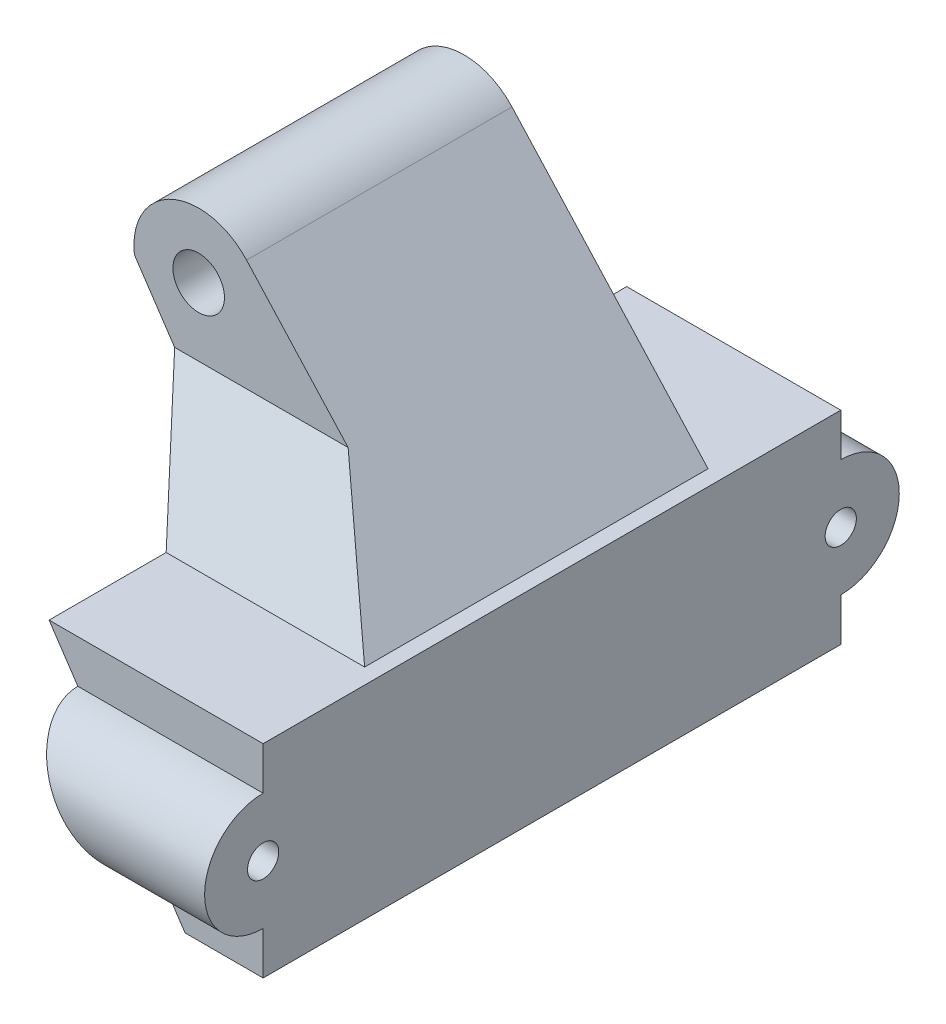
ISO-10303-21;
HEADER;
FILE_DESCRIPTION(('STEP AP214'),'2;1');
FILE_NAME('part.step','',(''),(''),'','','');
FILE_SCHEMA(('AUTOMOTIVE_DESIGN { 1 0 10303 214 1 1 1 1 }'));
ENDSEC;
DATA;
#1=APPLICATION_CONTEXT('core data for automotive mechanical design processes');
#2=APPLICATION_PROTOCOL_DEFINITION('international standard','automotive_design',2000,#1);
#3=PRODUCT_CONTEXT('',#1,'mechanical');
#4=PRODUCT('Part','Part','',(#3));
#5=PRODUCT_RELATED_PRODUCT_CATEGORY('part','',(#4));
#6=PRODUCT_DEFINITION_FORMATION('','',#4);
#7=PRODUCT_DEFINITION_CONTEXT('part definition',#1,'design');
#8=PRODUCT_DEFINITION('design','',#6,#7);
#9=PRODUCT_DEFINITION_SHAPE('','',#8);
#10=(LENGTH_UNIT() NAMED_UNIT(*) SI_UNIT(.MILLI.,.METRE.));
#11=(NAMED_UNIT(*) PLANE_ANGLE_UNIT() SI_UNIT($,.RADIAN.));
#12=(NAMED_UNIT(*) SI_UNIT($,.STERADIAN.) SOLID_ANGLE_UNIT());
#13=UNCERTAINTY_MEASURE_WITH_UNIT(LENGTH_MEASURE(1.E-05),#10,'distance_accuracy_value','');
#14=(GEOMETRIC_REPRESENTATION_CONTEXT(3) GLOBAL_UNCERTAINTY_ASSIGNED_CONTEXT((#13)) GLOBAL_UNIT_ASSIGNED_CONTEXT((#10,
#11,#12)) REPRESENTATION_CONTEXT('',''));
#15=CARTESIAN_POINT('',(0.,0.,0.));
#16=DIRECTION('',(0.,0.,1.));
#17=DIRECTION('',(1.,0.,0.));
#18=AXIS2_PLACEMENT_3D('',#15,#16,#17);
#19=CARTESIAN_POINT('',(0.,0.,-11.));
#20=DIRECTION('',(0.,0.,1.));
#21=DIRECTION('',(1.,0.,0.));
#22=AXIS2_PLACEMENT_3D('',#19,#20,#21);
#23=PLANE('',#22);
#24=CARTESIAN_POINT('',(0.,0.,-11.));
#25=DIRECTION('',(0.,0.,1.));
#26=DIRECTION('',(1.,0.,0.));
#27=AXIS2_PLACEMENT_3D('',#24,#25,#26);
#28=CIRCLE('',#27,1.65);
#29=CARTESIAN_POINT('',(1.65,0.,-11.));
#30=VERTEX_POINT('',#29);
#31=EDGE_CURVE('E140',#30,#30,#28,.T.);
#32=ORIENTED_EDGE('',*,*,#31,.T.);
#33=EDGE_LOOP('',(#32));
#34=FACE_BOUND('',#33,.T.);
#35=DIRECTION('',(1.,0.,0.));
#36=VECTOR('',#35,1.);
#37=CARTESIAN_POINT('',(0.,-11.,-11.));
#38=LINE('',#37,#36);
#39=CARTESIAN_POINT('',(2.91728849742033,-11.,-11.));
#40=VERTEX_POINT('',#39);
#41=CARTESIAN_POINT('',(15.6287254057007,-11.,-11.));
#42=VERTEX_POINT('',#41);
#43=EDGE_CURVE('E141',#40,#42,#38,.T.);
#44=ORIENTED_EDGE('',*,*,#43,.F.);
#45=DIRECTION('',(0.556679256856241,-0.830727515486265,0.));
#46=VECTOR('',#45,1.);
#47=CARTESIAN_POINT('',(-4.11996747168549,-0.498365360206194,-11.));
#48=LINE('',#47,#46);
#49=CARTESIAN_POINT('',(-4.11996747168549,-0.498365360206194,-11.));
#50=VERTEX_POINT('',#49);
#51=EDGE_CURVE('E222',#50,#40,#48,.T.);
#52=ORIENTED_EDGE('',*,*,#51,.F.);
#53=CARTESIAN_POINT('',(0.,0.,-11.));
#54=DIRECTION('',(0.,0.,1.));
#55=DIRECTION('',(1.,0.,0.));
#56=AXIS2_PLACEMENT_3D('',#53,#54,#55);
#57=CIRCLE('',#56,4.15);
#58=CARTESIAN_POINT('',(3.06851760696198,2.79404718925152,-11.));
#59=VERTEX_POINT('',#58);
#60=EDGE_CURVE('E220',#59,#50,#57,.T.);
#61=ORIENTED_EDGE('',*,*,#60,.F.);
#62=DIRECTION('',(-0.673264382952174,0.739401833002887,0.));
#63=VECTOR('',#62,1.);
#64=CARTESIAN_POINT('',(15.6287254057007,-11.,-11.));
#65=LINE('',#64,#63);
#66=EDGE_CURVE('E217',#42,#59,#65,.T.);
#67=ORIENTED_EDGE('',*,*,#66,.F.);
#68=EDGE_LOOP('',(#44,#52,#61,#67));
#69=FACE_BOUND('',#68,.T.);
#70=ADVANCED_FACE('F35',(#34,#69),#23,.F.);
#71=CARTESIAN_POINT('',(16.6287254057007,-11.,11.));
#72=DIRECTION('',(0.,-1.,0.));
#73=DIRECTION('',(1.,0.,0.));
#74=AXIS2_PLACEMENT_3D('',#71,#72,#73);
#75=PLANE('',#74);
#76=DIRECTION('',(0.,0.,-1.));
#77=VECTOR('',#76,1.);
#78=CARTESIAN_POINT('',(16.6287254057007,-11.,11.));
#79=LINE('',#78,#77);
#80=CARTESIAN_POINT('',(16.6287254057007,-11.,18.5));
#81=VERTEX_POINT('',#80);
#82=CARTESIAN_POINT('',(16.6287254057007,-11.,-18.5));
#83=VERTEX_POINT('',#82);
#84=EDGE_CURVE('E224',#81,#83,#79,.T.);
#85=ORIENTED_EDGE('',*,*,#84,.T.);
#86=DIRECTION('',(1.,0.,0.));
#87=VECTOR('',#86,1.);
#88=CARTESIAN_POINT('',(-43.8102507554737,-11.,-18.5));
#89=LINE('',#88,#87);
#90=CARTESIAN_POINT('',(2.91728849742033,-11.,-18.5));
#91=VERTEX_POINT('',#90);
#92=EDGE_CURVE('E206',#91,#83,#89,.T.);
#93=ORIENTED_EDGE('',*,*,#92,.F.);
#94=DIRECTION('',(0.,0.,1.));
#95=VECTOR('',#94,1.);
#96=CARTESIAN_POINT('',(2.91728849742033,-11.,0.));
#97=LINE('',#96,#95);
#98=EDGE_CURVE('E148',#91,#40,#97,.T.);
#99=ORIENTED_EDGE('',*,*,#98,.T.);
#100=ORIENTED_EDGE('',*,*,#43,.T.);
#101=DIRECTION('',(0.,0.,-1.));
#102=VECTOR('',#101,1.);
#103=CARTESIAN_POINT('',(15.6287254057007,-11.,11.));
#104=LINE('',#103,#102);
#105=CARTESIAN_POINT('',(15.6287254057007,-11.,11.));
#106=VERTEX_POINT('',#105);
#107=EDGE_CURVE('E43',#106,#42,#104,.T.);
#108=ORIENTED_EDGE('',*,*,#107,.F.);
#109=DIRECTION('',(1.,0.,0.));
#110=VECTOR('',#109,1.);
#111=CARTESIAN_POINT('',(0.,-11.,11.));
#112=LINE('',#111,#110);
#113=CARTESIAN_POINT('',(2.91728849742033,-11.,11.));
#114=VERTEX_POINT('',#113);
#115=EDGE_CURVE('E131',#114,#106,#112,.T.);
#116=ORIENTED_EDGE('',*,*,#115,.F.);
#117=CARTESIAN_POINT('',(2.91728849742033,-11.,18.5));
#118=VERTEX_POINT('',#117);
#119=EDGE_CURVE('E137',#114,#118,#97,.T.);
#120=ORIENTED_EDGE('',*,*,#119,.T.);
#121=DIRECTION('',(1.,0.,0.));
#122=VECTOR('',#121,1.);
#123=CARTESIAN_POINT('',(-43.8102507554737,-11.,18.5));
#124=LINE('',#123,#122);
#125=EDGE_CURVE('E204',#118,#81,#124,.T.);
#126=ORIENTED_EDGE('',*,*,#125,.T.);
#127=EDGE_LOOP('',(#85,#93,#99,#100,#108,#116,#120,#126));
#128=FACE_BOUND('',#127,.T.);
#129=ADVANCED_FACE('F37',(#128),#75,.F.);
#130=CARTESIAN_POINT('',(15.6287254057007,-11.,11.));
#131=DIRECTION('',(-0.739401833002887,-0.673264382952174,0.));
#132=DIRECTION('',(0.673264382952174,-0.739401833002887,0.));
#133=AXIS2_PLACEMENT_3D('',#130,#131,#132);
#134=PLANE('',#133);
#135=DIRECTION('',(0.,0.,-1.));
#136=VECTOR('',#135,1.);
#137=CARTESIAN_POINT('',(3.06851760696198,2.79404718925152,11.));
#138=LINE('',#137,#136);
#139=CARTESIAN_POINT('',(3.06851760696198,2.79404718925152,6.));
#140=VERTEX_POINT('',#139);
#141=EDGE_CURVE('E231',#140,#59,#138,.T.);
#142=ORIENTED_EDGE('',*,*,#141,.F.);
#143=DIRECTION('',(0.673264382952174,-0.739401833002887,0.));
#144=VECTOR('',#143,1.);
#145=CARTESIAN_POINT('',(15.6287254057007,-11.,6.));
#146=LINE('',#145,#144);
#147=CARTESIAN_POINT('',(9.57354952325945,-4.35,6.));
#148=VERTEX_POINT('',#147);
#149=EDGE_CURVE('E246',#140,#148,#146,.T.);
#150=ORIENTED_EDGE('',*,*,#149,.T.);
#151=DIRECTION('',(0.588442588566367,-0.646247654888709,0.485900492397526));
#152=VECTOR('',#151,1.);
#153=CARTESIAN_POINT('',(15.6287254057007,-11.,11.));
#154=LINE('',#153,#152);
#155=EDGE_CURVE('E173',#148,#106,#154,.T.);
#156=ORIENTED_EDGE('',*,*,#155,.T.);
#157=ORIENTED_EDGE('',*,*,#107,.T.);
#158=ORIENTED_EDGE('',*,*,#66,.T.);
#159=EDGE_LOOP('',(#142,#150,#156,#157,#158));
#160=FACE_BOUND('',#159,.T.);
#161=ADVANCED_FACE('F300',(#160),#134,.F.);
#162=CARTESIAN_POINT('',(0.,0.,11.));
#163=DIRECTION('',(0.,0.,-1.));
#164=DIRECTION('',(-1.,0.,0.));
#165=AXIS2_PLACEMENT_3D('',#162,#163,#164);
#166=CYLINDRICAL_SURFACE('',#165,4.15);
#167=DIRECTION('',(0.,0.,-1.));
#168=VECTOR('',#167,1.);
#169=CARTESIAN_POINT('',(-4.11996747168549,-0.498365360206194,11.));
#170=LINE('',#169,#168);
#171=CARTESIAN_POINT('',(-4.11996747168549,-0.498365360206194,6.));
#172=VERTEX_POINT('',#171);
#173=EDGE_CURVE('E58',#172,#50,#170,.T.);
#174=ORIENTED_EDGE('',*,*,#173,.F.);
#175=CARTESIAN_POINT('',(0.,0.,6.));
#176=DIRECTION('',(0.,0.,-1.));
#177=DIRECTION('',(0.,1.,0.));
#178=AXIS2_PLACEMENT_3D('',#175,#176,#177);
#179=CIRCLE('',#178,4.15);
#180=EDGE_CURVE('E238',#172,#140,#179,.T.);
#181=ORIENTED_EDGE('',*,*,#180,.T.);
#182=ORIENTED_EDGE('',*,*,#141,.T.);
#183=ORIENTED_EDGE('',*,*,#60,.T.);
#184=EDGE_LOOP('',(#174,#181,#182,#183));
#185=FACE_BOUND('',#184,.T.);
#186=ADVANCED_FACE('F312',(#185),#166,.T.);
#187=CARTESIAN_POINT('',(-4.11996747168549,-0.498365360206194,11.));
#188=DIRECTION('',(0.830727515486266,0.556679256856241,0.));
#189=DIRECTION('',(-0.556679256856241,0.830727515486266,0.));
#190=AXIS2_PLACEMENT_3D('',#187,#188,#189);
#191=PLANE('',#190);
#192=DIRECTION('',(-0.472146408909698,0.704579896571582,-0.529759320730514));
#193=VECTOR('',#192,1.);
#194=CARTESIAN_POINT('',(-2.14499720724337,-3.44559596154859,5.31999696357037));
#195=LINE('',#194,#193);
#196=CARTESIAN_POINT('',(-1.5389465364308,-4.35,6.));
#197=VERTEX_POINT('',#196);
#198=EDGE_CURVE('E11',#114,#197,#195,.T.);
#199=ORIENTED_EDGE('',*,*,#198,.T.);
#200=DIRECTION('',(-0.556679256856241,0.830727515486266,0.));
#201=VECTOR('',#200,1.);
#202=CARTESIAN_POINT('',(-4.11996747168549,-0.498365360206194,6.));
#203=LINE('',#202,#201);
#204=EDGE_CURVE('E235',#197,#172,#203,.T.);
#205=ORIENTED_EDGE('',*,*,#204,.T.);
#206=ORIENTED_EDGE('',*,*,#173,.T.);
#207=ORIENTED_EDGE('',*,*,#51,.T.);
#208=ORIENTED_EDGE('',*,*,#98,.F.);
#209=DIRECTION('',(-0.556679256856241,0.830727515486266,0.));
#210=VECTOR('',#209,1.);
#211=CARTESIAN_POINT('',(-16.6501290539271,18.2002835864801,-18.4999999999998));
#212=LINE('',#211,#210);
#213=CARTESIAN_POINT('',(4.76009245878734,-13.75,-18.5));
#214=VERTEX_POINT('',#213);
#215=EDGE_CURVE('E149',#214,#91,#212,.T.);
#216=ORIENTED_EDGE('',*,*,#215,.F.);
#217=CARTESIAN_POINT('',(7.27300695156052,-17.5,-18.5));
#218=DIRECTION('',(0.830727515486266,0.556679256856241,0.));
#219=DIRECTION('',(0.556679256856241,-0.830727515486266,0.));
#220=AXIS2_PLACEMENT_3D('',#217,#218,#219);
#221=ELLIPSE('',#220,4.51411555545375,3.75);
#222=CARTESIAN_POINT('',(9.78592144433372,-21.25,-18.5));
#223=VERTEX_POINT('',#222);
#224=EDGE_CURVE('E164',#214,#223,#221,.F.);
#225=ORIENTED_EDGE('',*,*,#224,.T.);
#226=DIRECTION('',(-0.556679256856241,0.830727515486266,0.));
#227=VECTOR('',#226,1.);
#228=CARTESIAN_POINT('',(-16.6501290539271,18.2002835864801,-18.4999999999998));
#229=LINE('',#228,#227);
#230=CARTESIAN_POINT('',(11.6287254057007,-24.,-18.5));
#231=VERTEX_POINT('',#230);
#232=EDGE_CURVE('E161',#231,#223,#229,.T.);
#233=ORIENTED_EDGE('',*,*,#232,.F.);
#234=DIRECTION('',(0.,0.,-1.));
#235=VECTOR('',#234,1.);
#236=CARTESIAN_POINT('',(11.6287254057007,-24.,11.));
#237=LINE('',#236,#235);
#238=CARTESIAN_POINT('',(11.6287254057007,-24.,18.5));
#239=VERTEX_POINT('',#238);
#240=EDGE_CURVE('E228',#239,#231,#237,.T.);
#241=ORIENTED_EDGE('',*,*,#240,.F.);
#242=DIRECTION('',(-0.556679256856241,0.830727515486266,0.));
#243=VECTOR('',#242,1.);
#244=CARTESIAN_POINT('',(-16.6501290539271,18.20028358648,18.5));
#245=LINE('',#244,#243);
#246=CARTESIAN_POINT('',(9.78592144433372,-21.25,18.5));
#247=VERTEX_POINT('',#246);
#248=EDGE_CURVE('E159',#239,#247,#245,.T.);
#249=ORIENTED_EDGE('',*,*,#248,.T.);
#250=CARTESIAN_POINT('',(7.27300695156052,-17.5,18.5));
#251=DIRECTION('',(0.830727515486266,0.556679256856241,0.));
#252=DIRECTION('',(0.556679256856241,-0.830727515486266,0.));
#253=AXIS2_PLACEMENT_3D('',#250,#251,#252);
#254=ELLIPSE('',#253,4.51411555545375,3.75);
#255=CARTESIAN_POINT('',(4.76009245878734,-13.75,18.5));
#256=VERTEX_POINT('',#255);
#257=EDGE_CURVE('E157',#247,#256,#254,.F.);
#258=ORIENTED_EDGE('',*,*,#257,.T.);
#259=DIRECTION('',(-0.556679256856241,0.830727515486266,0.));
#260=VECTOR('',#259,1.);
#261=CARTESIAN_POINT('',(-16.6501290539271,18.20028358648,18.5));
#262=LINE('',#261,#260);
#263=EDGE_CURVE('E146',#256,#118,#262,.T.);
#264=ORIENTED_EDGE('',*,*,#263,.T.);
#265=ORIENTED_EDGE('',*,*,#119,.F.);
#266=EDGE_LOOP('',(#199,#205,#206,#207,#208,#216,#225,#233,#241,#249,#258,#264,#265));
#267=FACE_BOUND('',#266,.T.);
#268=CARTESIAN_POINT('',(7.27300695156052,-17.5,-18.5));
#269=DIRECTION('',(0.830727515486266,0.556679256856241,0.));
#270=DIRECTION('',(0.556679256856241,-0.830727515486266,0.));
#271=AXIS2_PLACEMENT_3D('',#268,#269,#270);
#272=ELLIPSE('',#271,1.203764148121,1.);
#273=CARTESIAN_POINT('',(7.94311748296671,-18.5,-18.5));
#274=VERTEX_POINT('',#273);
#275=EDGE_CURVE('E165',#274,#274,#272,.F.);
#276=ORIENTED_EDGE('',*,*,#275,.F.);
#277=EDGE_LOOP('',(#276));
#278=FACE_BOUND('',#277,.T.);
#279=CARTESIAN_POINT('',(7.27300695156052,-17.5,18.5));
#280=DIRECTION('',(0.830727515486266,0.556679256856241,0.));
#281=DIRECTION('',(0.556679256856241,-0.830727515486266,0.));
#282=AXIS2_PLACEMENT_3D('',#279,#280,#281);
#283=ELLIPSE('',#282,1.203764148121,1.);
#284=CARTESIAN_POINT('',(7.94311748296671,-18.5,18.5));
#285=VERTEX_POINT('',#284);
#286=EDGE_CURVE('E168',#285,#285,#283,.F.);
#287=ORIENTED_EDGE('',*,*,#286,.F.);
#288=EDGE_LOOP('',(#287));
#289=FACE_BOUND('',#288,.T.);
#290=ADVANCED_FACE('F143',(#267,#278,#289),#191,.F.);
#291=CARTESIAN_POINT('',(11.6287254057007,-24.,11.));
#292=DIRECTION('',(0.,1.,0.));
#293=DIRECTION('',(0.,0.,1.));
#294=AXIS2_PLACEMENT_3D('',#291,#292,#293);
#295=PLANE('',#294);
#296=ORIENTED_EDGE('',*,*,#240,.T.);
#297=DIRECTION('',(1.,0.,0.));
#298=VECTOR('',#297,1.);
#299=CARTESIAN_POINT('',(-43.8102507554737,-24.,-18.5));
#300=LINE('',#299,#298);
#301=CARTESIAN_POINT('',(16.6287254057007,-24.,-18.5));
#302=VERTEX_POINT('',#301);
#303=EDGE_CURVE('E152',#231,#302,#300,.T.);
#304=ORIENTED_EDGE('',*,*,#303,.T.);
#305=DIRECTION('',(0.,0.,-1.));
#306=VECTOR('',#305,1.);
#307=CARTESIAN_POINT('',(16.6287254057007,-24.,11.));
#308=LINE('',#307,#306);
#309=CARTESIAN_POINT('',(16.6287254057007,-24.,18.5));
#310=VERTEX_POINT('',#309);
#311=EDGE_CURVE('E226',#310,#302,#308,.T.);
#312=ORIENTED_EDGE('',*,*,#311,.F.);
#313=DIRECTION('',(1.,0.,0.));
#314=VECTOR('',#313,1.);
#315=CARTESIAN_POINT('',(-43.8102507554737,-24.,18.5));
#316=LINE('',#315,#314);
#317=EDGE_CURVE('E197',#239,#310,#316,.T.);
#318=ORIENTED_EDGE('',*,*,#317,.F.);
#319=EDGE_LOOP('',(#296,#304,#312,#318));
#320=FACE_BOUND('',#319,.T.);
#321=ADVANCED_FACE('F266',(#320),#295,.F.);
#322=CARTESIAN_POINT('',(16.6287254057007,-24.,11.));
#323=DIRECTION('',(-1.,0.,0.));
#324=DIRECTION('',(0.,0.,1.));
#325=AXIS2_PLACEMENT_3D('',#322,#323,#324);
#326=PLANE('',#325);
#327=ORIENTED_EDGE('',*,*,#311,.T.);
#328=DIRECTION('',(0.,-1.,0.));
#329=VECTOR('',#328,1.);
#330=CARTESIAN_POINT('',(16.6287254057007,1.33306827115448E-13,-18.4999999999999));
#331=LINE('',#330,#329);
#332=CARTESIAN_POINT('',(16.6287254057007,-21.25,-18.5));
#333=VERTEX_POINT('',#332);
#334=EDGE_CURVE('E169',#333,#302,#331,.T.);
#335=ORIENTED_EDGE('',*,*,#334,.F.);
#336=CARTESIAN_POINT('',(16.6287254057007,-17.5,-18.5));
#337=DIRECTION('',(1.,0.,0.));
#338=DIRECTION('',(0.,0.,-1.));
#339=AXIS2_PLACEMENT_3D('',#336,#337,#338);
#340=CIRCLE('',#339,3.75);
#341=CARTESIAN_POINT('',(16.6287254057007,-13.75,-18.5));
#342=VERTEX_POINT('',#341);
#343=EDGE_CURVE('E172',#333,#342,#340,.T.);
#344=ORIENTED_EDGE('',*,*,#343,.T.);
#345=DIRECTION('',(0.,-1.,0.));
#346=VECTOR('',#345,1.);
#347=CARTESIAN_POINT('',(16.6287254057007,1.33306827115448E-13,-18.4999999999999));
#348=LINE('',#347,#346);
#349=EDGE_CURVE('E176',#83,#342,#348,.T.);
#350=ORIENTED_EDGE('',*,*,#349,.F.);
#351=ORIENTED_EDGE('',*,*,#84,.F.);
#352=DIRECTION('',(0.,-1.,0.));
#353=VECTOR('',#352,1.);
#354=CARTESIAN_POINT('',(16.6287254057007,0.,18.5));
#355=LINE('',#354,#353);
#356=CARTESIAN_POINT('',(16.6287254057007,-13.75,18.5));
#357=VERTEX_POINT('',#356);
#358=EDGE_CURVE('E179',#81,#357,#355,.T.);
#359=ORIENTED_EDGE('',*,*,#358,.T.);
#360=CARTESIAN_POINT('',(16.6287254057007,-17.5,18.5));
#361=DIRECTION('',(1.,0.,0.));
#362=DIRECTION('',(0.,0.,-1.));
#363=AXIS2_PLACEMENT_3D('',#360,#361,#362);
#364=CIRCLE('',#363,3.75);
#365=CARTESIAN_POINT('',(16.6287254057007,-21.25,18.5));
#366=VERTEX_POINT('',#365);
#367=EDGE_CURVE('E182',#357,#366,#364,.T.);
#368=ORIENTED_EDGE('',*,*,#367,.T.);
#369=DIRECTION('',(0.,-1.,0.));
#370=VECTOR('',#369,1.);
#371=CARTESIAN_POINT('',(16.6287254057007,0.,18.5));
#372=LINE('',#371,#370);
#373=EDGE_CURVE('E185',#366,#310,#372,.T.);
#374=ORIENTED_EDGE('',*,*,#373,.T.);
#375=EDGE_LOOP('',(#327,#335,#344,#350,#351,#359,#368,#374));
#376=FACE_BOUND('',#375,.T.);
#377=CARTESIAN_POINT('',(16.6287254057007,-17.5,-18.5));
#378=DIRECTION('',(1.,0.,0.));
#379=DIRECTION('',(0.,0.,-1.));
#380=AXIS2_PLACEMENT_3D('',#377,#378,#379);
#381=CIRCLE('',#380,1.);
#382=CARTESIAN_POINT('',(16.6287254057007,-17.5,-19.5));
#383=VERTEX_POINT('',#382);
#384=EDGE_CURVE('E188',#383,#383,#381,.T.);
#385=ORIENTED_EDGE('',*,*,#384,.F.);
#386=EDGE_LOOP('',(#385));
#387=FACE_BOUND('',#386,.T.);
#388=CARTESIAN_POINT('',(16.6287254057007,-17.5,18.5));
#389=DIRECTION('',(1.,0.,0.));
#390=DIRECTION('',(0.,0.,-1.));
#391=AXIS2_PLACEMENT_3D('',#388,#389,#390);
#392=CIRCLE('',#391,1.);
#393=CARTESIAN_POINT('',(16.6287254057007,-17.5,17.5));
#394=VERTEX_POINT('',#393);
#395=EDGE_CURVE('E191',#394,#394,#392,.T.);
#396=ORIENTED_EDGE('',*,*,#395,.F.);
#397=EDGE_LOOP('',(#396));
#398=FACE_BOUND('',#397,.T.);
#399=ADVANCED_FACE('F261',(#376,#387,#398),#326,.F.);
#400=CARTESIAN_POINT('',(0.,0.,11.));
#401=DIRECTION('',(0.,0.,-1.));
#402=DIRECTION('',(-1.,0.,0.));
#403=AXIS2_PLACEMENT_3D('',#400,#401,#402);
#404=CYLINDRICAL_SURFACE('',#403,1.65);
#405=CARTESIAN_POINT('',(0.,0.,6.));
#406=DIRECTION('',(0.,0.,-1.));
#407=DIRECTION('',(0.,1.,0.));
#408=AXIS2_PLACEMENT_3D('',#405,#406,#407);
#409=CIRCLE('',#408,1.65);
#410=CARTESIAN_POINT('',(0.,1.65,6.));
#411=VERTEX_POINT('',#410);
#412=EDGE_CURVE('E233',#411,#411,#409,.T.);
#413=ORIENTED_EDGE('',*,*,#412,.F.);
#414=EDGE_LOOP('',(#413));
#415=FACE_BOUND('',#414,.T.);
#416=ORIENTED_EDGE('',*,*,#31,.F.);
#417=EDGE_LOOP('',(#416));
#418=FACE_BOUND('',#417,.T.);
#419=ADVANCED_FACE('F304',(#415,#418),#404,.F.);
#420=CARTESIAN_POINT('',(-43.8102507554737,1.33306827115448E-13,-18.4999999999999));
#421=DIRECTION('',(0.,0.,1.));
#422=DIRECTION('',(0.,-1.,0.));
#423=AXIS2_PLACEMENT_3D('',#420,#421,#422);
#424=PLANE('',#423);
#425=ORIENTED_EDGE('',*,*,#303,.F.);
#426=ORIENTED_EDGE('',*,*,#232,.T.);
#427=DIRECTION('',(1.,0.,0.));
#428=VECTOR('',#427,1.);
#429=CARTESIAN_POINT('',(-43.8102507554737,-21.25,-18.5));
#430=LINE('',#429,#428);
#431=EDGE_CURVE('E194',#223,#333,#430,.T.);
#432=ORIENTED_EDGE('',*,*,#431,.T.);
#433=ORIENTED_EDGE('',*,*,#334,.T.);
#434=EDGE_LOOP('',(#425,#426,#432,#433));
#435=FACE_BOUND('',#434,.T.);
#436=ADVANCED_FACE('F255',(#435),#424,.F.);
#437=CARTESIAN_POINT('',(-43.8102507554737,-17.5,-18.5));
#438=DIRECTION('',(1.,0.,0.));
#439=DIRECTION('',(0.,0.,-1.));
#440=AXIS2_PLACEMENT_3D('',#437,#438,#439);
#441=CYLINDRICAL_SURFACE('',#440,3.75);
#442=ORIENTED_EDGE('',*,*,#224,.F.);
#443=DIRECTION('',(1.,0.,0.));
#444=VECTOR('',#443,1.);
#445=CARTESIAN_POINT('',(-43.8102507554737,-13.75,-18.5));
#446=LINE('',#445,#444);
#447=EDGE_CURVE('E209',#214,#342,#446,.T.);
#448=ORIENTED_EDGE('',*,*,#447,.T.);
#449=ORIENTED_EDGE('',*,*,#343,.F.);
#450=ORIENTED_EDGE('',*,*,#431,.F.);
#451=EDGE_LOOP('',(#442,#448,#449,#450));
#452=FACE_BOUND('',#451,.T.);
#453=ADVANCED_FACE('F258',(#452),#441,.T.);
#454=CARTESIAN_POINT('',(-43.8102507554737,1.33306827115448E-13,-18.4999999999999));
#455=DIRECTION('',(0.,0.,1.));
#456=DIRECTION('',(0.,-1.,0.));
#457=AXIS2_PLACEMENT_3D('',#454,#455,#456);
#458=PLANE('',#457);
#459=ORIENTED_EDGE('',*,*,#447,.F.);
#460=ORIENTED_EDGE('',*,*,#215,.T.);
#461=ORIENTED_EDGE('',*,*,#92,.T.);
#462=ORIENTED_EDGE('',*,*,#349,.T.);
#463=EDGE_LOOP('',(#459,#460,#461,#462));
#464=FACE_BOUND('',#463,.T.);
#465=ADVANCED_FACE('F281',(#464),#458,.F.);
#466=CARTESIAN_POINT('',(-43.8102507554737,-17.5,-18.5));
#467=DIRECTION('',(1.,0.,0.));
#468=DIRECTION('',(0.,0.,-1.));
#469=AXIS2_PLACEMENT_3D('',#466,#467,#468);
#470=CYLINDRICAL_SURFACE('',#469,1.);
#471=ORIENTED_EDGE('',*,*,#275,.T.);
#472=EDGE_LOOP('',(#471));
#473=FACE_BOUND('',#472,.T.);
#474=ORIENTED_EDGE('',*,*,#384,.T.);
#475=EDGE_LOOP('',(#474));
#476=FACE_BOUND('',#475,.T.);
#477=ADVANCED_FACE('F283',(#473,#476),#470,.F.);
#478=CARTESIAN_POINT('',(-43.8102507554737,0.,18.5));
#479=DIRECTION('',(0.,0.,1.));
#480=DIRECTION('',(1.,0.,0.));
#481=AXIS2_PLACEMENT_3D('',#478,#479,#480);
#482=PLANE('',#481);
#483=ORIENTED_EDGE('',*,*,#263,.F.);
#484=DIRECTION('',(1.,0.,0.));
#485=VECTOR('',#484,1.);
#486=CARTESIAN_POINT('',(-43.8102507554737,-13.75,18.5));
#487=LINE('',#486,#485);
#488=EDGE_CURVE('E202',#256,#357,#487,.T.);
#489=ORIENTED_EDGE('',*,*,#488,.T.);
#490=ORIENTED_EDGE('',*,*,#358,.F.);
#491=ORIENTED_EDGE('',*,*,#125,.F.);
#492=EDGE_LOOP('',(#483,#489,#490,#491));
#493=FACE_BOUND('',#492,.T.);
#494=ADVANCED_FACE('F277',(#493),#482,.T.);
#495=CARTESIAN_POINT('',(-43.8102507554737,-17.5,18.5));
#496=DIRECTION('',(1.,0.,0.));
#497=DIRECTION('',(0.,0.,-1.));
#498=AXIS2_PLACEMENT_3D('',#495,#496,#497);
#499=CYLINDRICAL_SURFACE('',#498,3.75);
#500=ORIENTED_EDGE('',*,*,#257,.F.);
#501=DIRECTION('',(1.,0.,0.));
#502=VECTOR('',#501,1.);
#503=CARTESIAN_POINT('',(-43.8102507554737,-21.25,18.5));
#504=LINE('',#503,#502);
#505=EDGE_CURVE('E200',#247,#366,#504,.T.);
#506=ORIENTED_EDGE('',*,*,#505,.T.);
#507=ORIENTED_EDGE('',*,*,#367,.F.);
#508=ORIENTED_EDGE('',*,*,#488,.F.);
#509=EDGE_LOOP('',(#500,#506,#507,#508));
#510=FACE_BOUND('',#509,.T.);
#511=ADVANCED_FACE('F274',(#510),#499,.T.);
#512=CARTESIAN_POINT('',(-43.8102507554737,0.,18.5));
#513=DIRECTION('',(0.,0.,1.));
#514=DIRECTION('',(1.,0.,0.));
#515=AXIS2_PLACEMENT_3D('',#512,#513,#514);
#516=PLANE('',#515);
#517=ORIENTED_EDGE('',*,*,#248,.F.);
#518=ORIENTED_EDGE('',*,*,#317,.T.);
#519=ORIENTED_EDGE('',*,*,#373,.F.);
#520=ORIENTED_EDGE('',*,*,#505,.F.);
#521=EDGE_LOOP('',(#517,#518,#519,#520));
#522=FACE_BOUND('',#521,.T.);
#523=ADVANCED_FACE('F271',(#522),#516,.T.);
#524=CARTESIAN_POINT('',(-43.8102507554737,-17.5,18.5));
#525=DIRECTION('',(1.,0.,0.));
#526=DIRECTION('',(0.,0.,-1.));
#527=AXIS2_PLACEMENT_3D('',#524,#525,#526);
#528=CYLINDRICAL_SURFACE('',#527,1.);
#529=ORIENTED_EDGE('',*,*,#286,.T.);
#530=EDGE_LOOP('',(#529));
#531=FACE_BOUND('',#530,.T.);
#532=ORIENTED_EDGE('',*,*,#395,.T.);
#533=EDGE_LOOP('',(#532));
#534=FACE_BOUND('',#533,.T.);
#535=ADVANCED_FACE('F329',(#531,#534),#528,.F.);
#536=CARTESIAN_POINT('',(-13.3712745942993,-4.35,6.));
#537=DIRECTION('',(0.,-0.600961104381756,-0.799278268827735));
#538=DIRECTION('',(0.,0.799278268827735,-0.600961104381756));
#539=AXIS2_PLACEMENT_3D('',#536,#537,#538);
#540=PLANE('',#539);
#541=DIRECTION('',(1.,0.,0.));
#542=VECTOR('',#541,1.);
#543=CARTESIAN_POINT('',(-13.3712745942993,-4.35,6.));
#544=LINE('',#543,#542);
#545=EDGE_CURVE('E50',#197,#148,#544,.T.);
#546=ORIENTED_EDGE('',*,*,#545,.F.);
#547=ORIENTED_EDGE('',*,*,#198,.F.);
#548=ORIENTED_EDGE('',*,*,#115,.T.);
#549=ORIENTED_EDGE('',*,*,#155,.F.);
#550=EDGE_LOOP('',(#546,#547,#548,#549));
#551=FACE_BOUND('',#550,.T.);
#552=ADVANCED_FACE('F130',(#551),#540,.F.);
#553=CARTESIAN_POINT('',(-13.3712745942993,4.15,6.));
#554=DIRECTION('',(0.,0.,-1.));
#555=DIRECTION('',(0.,1.,0.));
#556=AXIS2_PLACEMENT_3D('',#553,#554,#555);
#557=PLANE('',#556);
#558=ORIENTED_EDGE('',*,*,#412,.T.);
#559=EDGE_LOOP('',(#558));
#560=FACE_BOUND('',#559,.T.);
#561=ORIENTED_EDGE('',*,*,#180,.F.);
#562=ORIENTED_EDGE('',*,*,#204,.F.);
#563=ORIENTED_EDGE('',*,*,#545,.T.);
#564=ORIENTED_EDGE('',*,*,#149,.F.);
#565=EDGE_LOOP('',(#561,#562,#563,#564));
#566=FACE_BOUND('',#565,.T.);
#567=ADVANCED_FACE('F323',(#560,#566),#557,.F.);
#568=CLOSED_SHELL('',(#70,#129,#161,#186,#290,#321,#399,#419,#436,#453,#465,#477,#494,#511,#523,
#535,#552,#567));
#569=MANIFOLD_SOLID_BREP('B2',#568);
#570=ADVANCED_BREP_SHAPE_REPRESENTATION('',(#18,#569),#14);
#571=SHAPE_DEFINITION_REPRESENTATION(#9,#570);
ENDSEC;
END-ISO-10303-21;
